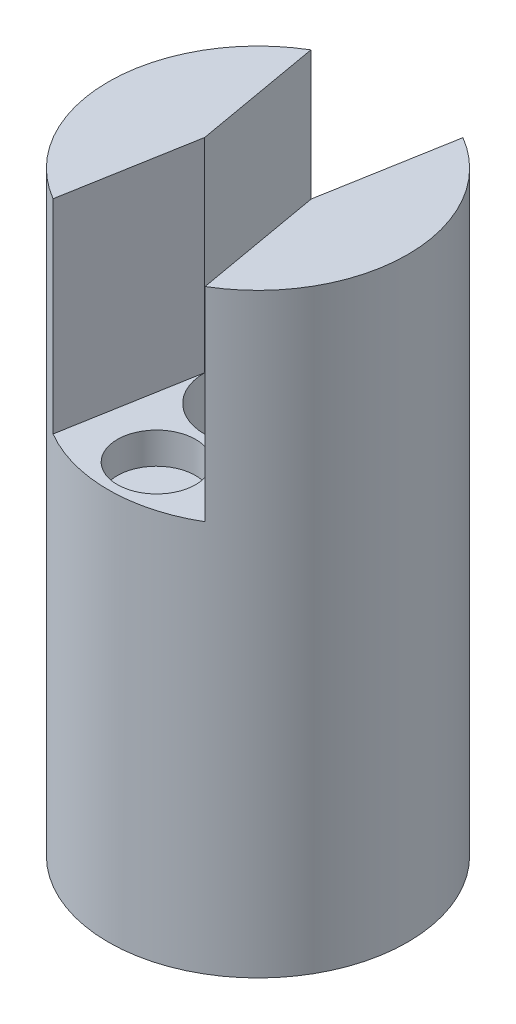
ISO-10303-21;
HEADER;
FILE_DESCRIPTION(('STEP AP214'),'2;1');
FILE_NAME('part.step','',(''),(''),'','','');
FILE_SCHEMA(('AUTOMOTIVE_DESIGN { 1 0 10303 214 1 1 1 1 }'));
ENDSEC;
DATA;
#1=APPLICATION_CONTEXT('core data for automotive mechanical design processes');
#2=APPLICATION_PROTOCOL_DEFINITION('international standard','automotive_design',2000,#1);
#3=PRODUCT_CONTEXT('',#1,'mechanical');
#4=PRODUCT('Part','Part','',(#3));
#5=PRODUCT_RELATED_PRODUCT_CATEGORY('part','',(#4));
#6=PRODUCT_DEFINITION_FORMATION('','',#4);
#7=PRODUCT_DEFINITION_CONTEXT('part definition',#1,'design');
#8=PRODUCT_DEFINITION('design','',#6,#7);
#9=PRODUCT_DEFINITION_SHAPE('','',#8);
#10=(LENGTH_UNIT() NAMED_UNIT(*) SI_UNIT(.MILLI.,.METRE.));
#11=(NAMED_UNIT(*) PLANE_ANGLE_UNIT() SI_UNIT($,.RADIAN.));
#12=(NAMED_UNIT(*) SI_UNIT($,.STERADIAN.) SOLID_ANGLE_UNIT());
#13=UNCERTAINTY_MEASURE_WITH_UNIT(LENGTH_MEASURE(1.E-05),#10,'distance_accuracy_value','');
#14=(GEOMETRIC_REPRESENTATION_CONTEXT(3) GLOBAL_UNCERTAINTY_ASSIGNED_CONTEXT((#13)) GLOBAL_UNIT_ASSIGNED_CONTEXT((#10,
#11,#12)) REPRESENTATION_CONTEXT('',''));
#15=CARTESIAN_POINT('',(0.,0.,0.));
#16=DIRECTION('',(0.,0.,1.));
#17=DIRECTION('',(1.,0.,0.));
#18=AXIS2_PLACEMENT_3D('',#15,#16,#17);
#19=CARTESIAN_POINT('',(0.,25.,0.));
#20=DIRECTION('',(0.,-1.,0.));
#21=DIRECTION('',(0.,0.,-1.));
#22=AXIS2_PLACEMENT_3D('',#19,#20,#21);
#23=CYLINDRICAL_SURFACE('',#22,3.4);
#24=CARTESIAN_POINT('',(0.,20.,0.));
#25=DIRECTION('',(0.,1.,0.));
#26=DIRECTION('',(0.,0.,1.));
#27=AXIS2_PLACEMENT_3D('',#24,#25,#26);
#28=CIRCLE('',#27,3.4);
#29=CARTESIAN_POINT('',(0.,20.,3.4));
#30=VERTEX_POINT('',#29);
#31=EDGE_CURVE('E12',#30,#30,#28,.T.);
#32=ORIENTED_EDGE('',*,*,#31,.F.);
#33=EDGE_LOOP('',(#32));
#34=FACE_BOUND('',#33,.T.);
#35=CARTESIAN_POINT('',(0.,25.,0.));
#36=DIRECTION('',(0.,1.,0.));
#37=DIRECTION('',(0.,0.,1.));
#38=AXIS2_PLACEMENT_3D('',#35,#36,#37);
#39=CIRCLE('',#38,3.4);
#40=CARTESIAN_POINT('',(-3.4,25.,0.));
#41=VERTEX_POINT('',#40);
#42=CARTESIAN_POINT('',(3.4,25.,0.));
#43=VERTEX_POINT('',#42);
#44=EDGE_CURVE('E114',#41,#43,#39,.T.);
#45=ORIENTED_EDGE('',*,*,#44,.T.);
#46=CARTESIAN_POINT('',(0.,25.,0.));
#47=DIRECTION('',(0.,1.,0.));
#48=DIRECTION('',(0.,0.,1.));
#49=AXIS2_PLACEMENT_3D('',#46,#47,#48);
#50=CIRCLE('',#49,3.4);
#51=EDGE_CURVE('E144',#43,#41,#50,.T.);
#52=ORIENTED_EDGE('',*,*,#51,.T.);
#53=EDGE_LOOP('',(#45,#52));
#54=FACE_BOUND('',#53,.T.);
#55=ADVANCED_FACE('F57',(#34,#54),#23,.F.);
#56=CARTESIAN_POINT('',(0.,25.,0.));
#57=DIRECTION('',(0.,-1.,0.));
#58=DIRECTION('',(0.,0.,-1.));
#59=AXIS2_PLACEMENT_3D('',#56,#57,#58);
#60=CYLINDRICAL_SURFACE('',#59,9.55);
#61=CARTESIAN_POINT('',(0.,0.,0.));
#62=DIRECTION('',(0.,1.,0.));
#63=DIRECTION('',(0.,0.,1.));
#64=AXIS2_PLACEMENT_3D('',#61,#62,#63);
#65=CIRCLE('',#64,9.55);
#66=CARTESIAN_POINT('',(0.,0.,9.55));
#67=VERTEX_POINT('',#66);
#68=EDGE_CURVE('E158',#67,#67,#65,.T.);
#69=ORIENTED_EDGE('',*,*,#68,.T.);
#70=EDGE_LOOP('',(#69));
#71=FACE_BOUND('',#70,.T.);
#72=DIRECTION('',(0.,-1.,0.));
#73=VECTOR('',#72,1.);
#74=CARTESIAN_POINT('',(4.85054734967224,38.,8.22646281269098));
#75=LINE('',#74,#73);
#76=CARTESIAN_POINT('',(4.85054734967224,38.,8.22646281269098));
#77=VERTEX_POINT('',#76);
#78=CARTESIAN_POINT('',(4.85054734967224,25.,8.22646281269098));
#79=VERTEX_POINT('',#78);
#80=EDGE_CURVE('E160',#77,#79,#75,.T.);
#81=ORIENTED_EDGE('',*,*,#80,.T.);
#82=CARTESIAN_POINT('',(0.,25.,0.));
#83=DIRECTION('',(0.,1.,0.));
#84=DIRECTION('',(0.,0.,1.));
#85=AXIS2_PLACEMENT_3D('',#82,#83,#84);
#86=CIRCLE('',#85,9.55);
#87=CARTESIAN_POINT('',(-4.85054734967224,25.,8.22646281269098));
#88=VERTEX_POINT('',#87);
#89=EDGE_CURVE('E132',#88,#79,#86,.T.);
#90=ORIENTED_EDGE('',*,*,#89,.F.);
#91=DIRECTION('',(0.,-1.,0.));
#92=VECTOR('',#91,1.);
#93=CARTESIAN_POINT('',(-4.85054734967224,38.,8.22646281269098));
#94=LINE('',#93,#92);
#95=CARTESIAN_POINT('',(-4.85054734967224,38.,8.22646281269098));
#96=VERTEX_POINT('',#95);
#97=EDGE_CURVE('E131',#96,#88,#94,.T.);
#98=ORIENTED_EDGE('',*,*,#97,.F.);
#99=CARTESIAN_POINT('',(0.,38.,0.));
#100=DIRECTION('',(0.,1.,0.));
#101=DIRECTION('',(0.,0.,1.));
#102=AXIS2_PLACEMENT_3D('',#99,#100,#101);
#103=CIRCLE('',#102,9.55);
#104=CARTESIAN_POINT('',(-4.85054734967224,38.,-8.22646281269098));
#105=VERTEX_POINT('',#104);
#106=EDGE_CURVE('E195',#105,#96,#103,.T.);
#107=ORIENTED_EDGE('',*,*,#106,.F.);
#108=DIRECTION('',(0.,-1.,0.));
#109=VECTOR('',#108,1.);
#110=CARTESIAN_POINT('',(-4.85054734967224,38.,-8.22646281269098));
#111=LINE('',#110,#109);
#112=CARTESIAN_POINT('',(-4.85054734967224,25.,-8.22646281269098));
#113=VERTEX_POINT('',#112);
#114=EDGE_CURVE('E191',#105,#113,#111,.T.);
#115=ORIENTED_EDGE('',*,*,#114,.T.);
#116=CARTESIAN_POINT('',(0.,25.,0.));
#117=DIRECTION('',(0.,1.,0.));
#118=DIRECTION('',(0.,0.,1.));
#119=AXIS2_PLACEMENT_3D('',#116,#117,#118);
#120=CIRCLE('',#119,9.55);
#121=CARTESIAN_POINT('',(4.85054734967224,25.,-8.22646281269098));
#122=VERTEX_POINT('',#121);
#123=EDGE_CURVE('E80',#122,#113,#120,.T.);
#124=ORIENTED_EDGE('',*,*,#123,.F.);
#125=DIRECTION('',(0.,-1.,0.));
#126=VECTOR('',#125,1.);
#127=CARTESIAN_POINT('',(4.85054734967224,38.,-8.22646281269098));
#128=LINE('',#127,#126);
#129=CARTESIAN_POINT('',(4.85054734967224,38.,-8.22646281269098));
#130=VERTEX_POINT('',#129);
#131=EDGE_CURVE('E178',#130,#122,#128,.T.);
#132=ORIENTED_EDGE('',*,*,#131,.F.);
#133=CARTESIAN_POINT('',(0.,38.,0.));
#134=DIRECTION('',(0.,1.,0.));
#135=DIRECTION('',(0.,0.,1.));
#136=AXIS2_PLACEMENT_3D('',#133,#134,#135);
#137=CIRCLE('',#136,9.55);
#138=EDGE_CURVE('E186',#77,#130,#137,.T.);
#139=ORIENTED_EDGE('',*,*,#138,.F.);
#140=EDGE_LOOP('',(#81,#90,#98,#107,#115,#124,#132,#139));
#141=FACE_BOUND('',#140,.T.);
#142=ADVANCED_FACE('F168',(#71,#141),#60,.T.);
#143=CARTESIAN_POINT('',(0.,25.,-6.475));
#144=DIRECTION('',(0.,-1.,0.));
#145=DIRECTION('',(0.,0.,-1.));
#146=AXIS2_PLACEMENT_3D('',#143,#144,#145);
#147=CYLINDRICAL_SURFACE('',#146,2.5);
#148=CARTESIAN_POINT('',(0.,23.,-6.475));
#149=DIRECTION('',(0.,1.,0.));
#150=DIRECTION('',(0.,0.,1.));
#151=AXIS2_PLACEMENT_3D('',#148,#149,#150);
#152=CIRCLE('',#151,2.5);
#153=CARTESIAN_POINT('',(0.,23.,-3.975));
#154=VERTEX_POINT('',#153);
#155=EDGE_CURVE('E65',#154,#154,#152,.T.);
#156=ORIENTED_EDGE('',*,*,#155,.F.);
#157=EDGE_LOOP('',(#156));
#158=FACE_BOUND('',#157,.T.);
#159=CARTESIAN_POINT('',(0.,25.,-6.475));
#160=DIRECTION('',(0.,1.,0.));
#161=DIRECTION('',(0.,0.,1.));
#162=AXIS2_PLACEMENT_3D('',#159,#160,#161);
#163=CIRCLE('',#162,2.5);
#164=CARTESIAN_POINT('',(0.,25.,-3.975));
#165=VERTEX_POINT('',#164);
#166=EDGE_CURVE('E148',#165,#165,#163,.T.);
#167=ORIENTED_EDGE('',*,*,#166,.T.);
#168=EDGE_LOOP('',(#167));
#169=FACE_BOUND('',#168,.T.);
#170=ADVANCED_FACE('F59',(#158,#169),#147,.F.);
#171=CARTESIAN_POINT('',(0.,25.,0.));
#172=DIRECTION('',(0.,1.,0.));
#173=DIRECTION('',(0.,0.,1.));
#174=AXIS2_PLACEMENT_3D('',#171,#172,#173);
#175=PLANE('',#174);
#176=ORIENTED_EDGE('',*,*,#166,.F.);
#177=EDGE_LOOP('',(#176));
#178=FACE_BOUND('',#177,.T.);
#179=ORIENTED_EDGE('',*,*,#51,.F.);
#180=DIRECTION('',(0.173648177666927,0.,-0.984807753012209));
#181=VECTOR('',#180,1.);
#182=CARTESIAN_POINT('',(3.29747745533605,25.,0.581434243653627));
#183=LINE('',#182,#181);
#184=EDGE_CURVE('E147',#43,#122,#183,.T.);
#185=ORIENTED_EDGE('',*,*,#184,.T.);
#186=ORIENTED_EDGE('',*,*,#123,.T.);
#187=DIRECTION('',(-0.173648177666927,0.,-0.984807753012209));
#188=VECTOR('',#187,1.);
#189=CARTESIAN_POINT('',(-3.29747745533605,25.,0.581434243653627));
#190=LINE('',#189,#188);
#191=EDGE_CURVE('E138',#41,#113,#190,.T.);
#192=ORIENTED_EDGE('',*,*,#191,.F.);
#193=EDGE_LOOP('',(#179,#185,#186,#192));
#194=FACE_BOUND('',#193,.T.);
#195=ADVANCED_FACE('F150',(#178,#194),#175,.T.);
#196=CARTESIAN_POINT('',(0.,0.,0.));
#197=DIRECTION('',(0.,1.,0.));
#198=DIRECTION('',(0.,0.,1.));
#199=AXIS2_PLACEMENT_3D('',#196,#197,#198);
#200=PLANE('',#199);
#201=ORIENTED_EDGE('',*,*,#68,.F.);
#202=EDGE_LOOP('',(#201));
#203=FACE_BOUND('',#202,.T.);
#204=CARTESIAN_POINT('',(0.,0.,0.));
#205=DIRECTION('',(0.,1.,0.));
#206=DIRECTION('',(0.,0.,1.));
#207=AXIS2_PLACEMENT_3D('',#204,#205,#206);
#208=CIRCLE('',#207,1.);
#209=CARTESIAN_POINT('',(0.,0.,1.));
#210=VERTEX_POINT('',#209);
#211=EDGE_CURVE('E203',#210,#210,#208,.T.);
#212=ORIENTED_EDGE('',*,*,#211,.T.);
#213=EDGE_LOOP('',(#212));
#214=FACE_BOUND('',#213,.T.);
#215=ADVANCED_FACE('F225',(#203,#214),#200,.F.);
#216=CARTESIAN_POINT('',(3.29747745533605,38.,-0.581434243653627));
#217=DIRECTION('',(0.984807753012209,0.,-0.173648177666927));
#218=DIRECTION('',(-0.173648177666927,0.,-0.984807753012209));
#219=AXIS2_PLACEMENT_3D('',#216,#217,#218);
#220=PLANE('',#219);
#221=DIRECTION('',(0.,-1.,0.));
#222=VECTOR('',#221,1.);
#223=CARTESIAN_POINT('',(3.4,38.,0.));
#224=LINE('',#223,#222);
#225=CARTESIAN_POINT('',(3.4,38.,0.));
#226=VERTEX_POINT('',#225);
#227=EDGE_CURVE('E182',#226,#43,#224,.T.);
#228=ORIENTED_EDGE('',*,*,#227,.T.);
#229=DIRECTION('',(0.173648177666927,0.,0.984807753012209));
#230=VECTOR('',#229,1.);
#231=CARTESIAN_POINT('',(3.29747745533605,25.,-0.581434243653627));
#232=LINE('',#231,#230);
#233=EDGE_CURVE('E72',#43,#79,#232,.T.);
#234=ORIENTED_EDGE('',*,*,#233,.T.);
#235=ORIENTED_EDGE('',*,*,#80,.F.);
#236=DIRECTION('',(0.173648177666927,0.,0.984807753012209));
#237=VECTOR('',#236,1.);
#238=CARTESIAN_POINT('',(3.29747745533605,38.,-0.581434243653627));
#239=LINE('',#238,#237);
#240=EDGE_CURVE('E188',#226,#77,#239,.T.);
#241=ORIENTED_EDGE('',*,*,#240,.F.);
#242=EDGE_LOOP('',(#228,#234,#235,#241));
#243=FACE_BOUND('',#242,.T.);
#244=ADVANCED_FACE('F228',(#243),#220,.F.);
#245=CARTESIAN_POINT('',(3.29747745533605,38.,0.581434243653627));
#246=DIRECTION('',(-0.984807753012209,0.,-0.173648177666927));
#247=DIRECTION('',(-0.173648177666927,0.,0.984807753012209));
#248=AXIS2_PLACEMENT_3D('',#245,#246,#247);
#249=PLANE('',#248);
#250=ORIENTED_EDGE('',*,*,#131,.T.);
#251=ORIENTED_EDGE('',*,*,#184,.F.);
#252=ORIENTED_EDGE('',*,*,#227,.F.);
#253=DIRECTION('',(0.173648177666927,0.,-0.984807753012209));
#254=VECTOR('',#253,1.);
#255=CARTESIAN_POINT('',(3.29747745533605,38.,0.581434243653627));
#256=LINE('',#255,#254);
#257=EDGE_CURVE('E181',#226,#130,#256,.T.);
#258=ORIENTED_EDGE('',*,*,#257,.T.);
#259=EDGE_LOOP('',(#250,#251,#252,#258));
#260=FACE_BOUND('',#259,.T.);
#261=ADVANCED_FACE('F179',(#260),#249,.T.);
#262=CARTESIAN_POINT('',(0.,38.,0.));
#263=DIRECTION('',(0.,1.,0.));
#264=DIRECTION('',(0.,0.,1.));
#265=AXIS2_PLACEMENT_3D('',#262,#263,#264);
#266=PLANE('',#265);
#267=ORIENTED_EDGE('',*,*,#240,.T.);
#268=ORIENTED_EDGE('',*,*,#138,.T.);
#269=ORIENTED_EDGE('',*,*,#257,.F.);
#270=EDGE_LOOP('',(#267,#268,#269));
#271=FACE_BOUND('',#270,.T.);
#272=ADVANCED_FACE('F236',(#271),#266,.T.);
#273=CARTESIAN_POINT('',(-3.29747745533605,38.,0.581434243653627));
#274=DIRECTION('',(-0.984807753012209,0.,0.173648177666927));
#275=DIRECTION('',(0.173648177666927,0.,0.984807753012209));
#276=AXIS2_PLACEMENT_3D('',#273,#274,#275);
#277=PLANE('',#276);
#278=ORIENTED_EDGE('',*,*,#191,.T.);
#279=ORIENTED_EDGE('',*,*,#114,.F.);
#280=DIRECTION('',(-0.173648177666927,0.,-0.984807753012209));
#281=VECTOR('',#280,1.);
#282=CARTESIAN_POINT('',(-3.29747745533605,38.,0.581434243653627));
#283=LINE('',#282,#281);
#284=CARTESIAN_POINT('',(-3.4,38.,0.));
#285=VERTEX_POINT('',#284);
#286=EDGE_CURVE('E140',#285,#105,#283,.T.);
#287=ORIENTED_EDGE('',*,*,#286,.F.);
#288=DIRECTION('',(0.,-1.,0.));
#289=VECTOR('',#288,1.);
#290=CARTESIAN_POINT('',(-3.4,38.,0.));
#291=LINE('',#290,#289);
#292=EDGE_CURVE('E128',#285,#41,#291,.T.);
#293=ORIENTED_EDGE('',*,*,#292,.T.);
#294=EDGE_LOOP('',(#278,#279,#287,#293));
#295=FACE_BOUND('',#294,.T.);
#296=ADVANCED_FACE('F135',(#295),#277,.F.);
#297=CARTESIAN_POINT('',(-3.29747745533605,38.,-0.581434243653627));
#298=DIRECTION('',(0.984807753012209,0.,0.173648177666927));
#299=DIRECTION('',(0.173648177666927,0.,-0.984807753012209));
#300=AXIS2_PLACEMENT_3D('',#297,#298,#299);
#301=PLANE('',#300);
#302=DIRECTION('',(-0.173648177666927,0.,0.984807753012209));
#303=VECTOR('',#302,1.);
#304=CARTESIAN_POINT('',(-3.29747745533605,25.,-0.581434243653627));
#305=LINE('',#304,#303);
#306=EDGE_CURVE('E118',#41,#88,#305,.T.);
#307=ORIENTED_EDGE('',*,*,#306,.F.);
#308=ORIENTED_EDGE('',*,*,#292,.F.);
#309=DIRECTION('',(-0.173648177666927,0.,0.984807753012209));
#310=VECTOR('',#309,1.);
#311=CARTESIAN_POINT('',(-3.29747745533605,38.,-0.581434243653627));
#312=LINE('',#311,#310);
#313=EDGE_CURVE('E142',#285,#96,#312,.T.);
#314=ORIENTED_EDGE('',*,*,#313,.T.);
#315=ORIENTED_EDGE('',*,*,#97,.T.);
#316=EDGE_LOOP('',(#307,#308,#314,#315));
#317=FACE_BOUND('',#316,.T.);
#318=ADVANCED_FACE('F126',(#317),#301,.T.);
#319=CARTESIAN_POINT('',(0.,38.,0.));
#320=DIRECTION('',(0.,1.,0.));
#321=DIRECTION('',(0.,0.,1.));
#322=AXIS2_PLACEMENT_3D('',#319,#320,#321);
#323=PLANE('',#322);
#324=ORIENTED_EDGE('',*,*,#286,.T.);
#325=ORIENTED_EDGE('',*,*,#106,.T.);
#326=ORIENTED_EDGE('',*,*,#313,.F.);
#327=EDGE_LOOP('',(#324,#325,#326));
#328=FACE_BOUND('',#327,.T.);
#329=ADVANCED_FACE('F244',(#328),#323,.T.);
#330=CARTESIAN_POINT('',(0.,25.,6.475));
#331=DIRECTION('',(0.,-1.,0.));
#332=DIRECTION('',(0.,0.,-1.));
#333=AXIS2_PLACEMENT_3D('',#330,#331,#332);
#334=CYLINDRICAL_SURFACE('',#333,2.5);
#335=CARTESIAN_POINT('',(0.,23.,6.475));
#336=DIRECTION('',(0.,1.,0.));
#337=DIRECTION('',(0.,0.,1.));
#338=AXIS2_PLACEMENT_3D('',#335,#336,#337);
#339=CIRCLE('',#338,2.5);
#340=CARTESIAN_POINT('',(0.,23.,8.975));
#341=VERTEX_POINT('',#340);
#342=EDGE_CURVE('E151',#341,#341,#339,.T.);
#343=ORIENTED_EDGE('',*,*,#342,.F.);
#344=EDGE_LOOP('',(#343));
#345=FACE_BOUND('',#344,.T.);
#346=CARTESIAN_POINT('',(0.,25.,6.475));
#347=DIRECTION('',(0.,1.,0.));
#348=DIRECTION('',(0.,0.,1.));
#349=AXIS2_PLACEMENT_3D('',#346,#347,#348);
#350=CIRCLE('',#349,2.5);
#351=CARTESIAN_POINT('',(0.,25.,8.975));
#352=VERTEX_POINT('',#351);
#353=EDGE_CURVE('E122',#352,#352,#350,.T.);
#354=ORIENTED_EDGE('',*,*,#353,.T.);
#355=EDGE_LOOP('',(#354));
#356=FACE_BOUND('',#355,.T.);
#357=ADVANCED_FACE('F247',(#345,#356),#334,.F.);
#358=CARTESIAN_POINT('',(0.,25.,0.));
#359=DIRECTION('',(0.,1.,0.));
#360=DIRECTION('',(0.,0.,1.));
#361=AXIS2_PLACEMENT_3D('',#358,#359,#360);
#362=PLANE('',#361);
#363=ORIENTED_EDGE('',*,*,#353,.F.);
#364=EDGE_LOOP('',(#363));
#365=FACE_BOUND('',#364,.T.);
#366=ORIENTED_EDGE('',*,*,#44,.F.);
#367=ORIENTED_EDGE('',*,*,#306,.T.);
#368=ORIENTED_EDGE('',*,*,#89,.T.);
#369=ORIENTED_EDGE('',*,*,#233,.F.);
#370=EDGE_LOOP('',(#366,#367,#368,#369));
#371=FACE_BOUND('',#370,.T.);
#372=ADVANCED_FACE('F116',(#365,#371),#362,.T.);
#373=CARTESIAN_POINT('',(0.,23.,0.));
#374=DIRECTION('',(0.,1.,0.));
#375=DIRECTION('',(0.,0.,1.));
#376=AXIS2_PLACEMENT_3D('',#373,#374,#375);
#377=PLANE('',#376);
#378=ORIENTED_EDGE('',*,*,#342,.T.);
#379=EDGE_LOOP('',(#378));
#380=FACE_BOUND('',#379,.T.);
#381=ADVANCED_FACE('F254',(#380),#377,.T.);
#382=CARTESIAN_POINT('',(0.,23.,0.));
#383=DIRECTION('',(0.,1.,0.));
#384=DIRECTION('',(0.,0.,1.));
#385=AXIS2_PLACEMENT_3D('',#382,#383,#384);
#386=PLANE('',#385);
#387=ORIENTED_EDGE('',*,*,#155,.T.);
#388=EDGE_LOOP('',(#387));
#389=FACE_BOUND('',#388,.T.);
#390=ADVANCED_FACE('F164',(#389),#386,.T.);
#391=CARTESIAN_POINT('',(0.,20.,0.));
#392=DIRECTION('',(0.,-1.,0.));
#393=DIRECTION('',(0.,0.,-1.));
#394=AXIS2_PLACEMENT_3D('',#391,#392,#393);
#395=CYLINDRICAL_SURFACE('',#394,1.);
#396=CARTESIAN_POINT('',(0.,20.,0.));
#397=DIRECTION('',(0.,1.,0.));
#398=DIRECTION('',(0.,0.,1.));
#399=AXIS2_PLACEMENT_3D('',#396,#397,#398);
#400=CIRCLE('',#399,1.);
#401=CARTESIAN_POINT('',(0.,20.,1.));
#402=VERTEX_POINT('',#401);
#403=EDGE_CURVE('E202',#402,#402,#400,.T.);
#404=ORIENTED_EDGE('',*,*,#403,.T.);
#405=EDGE_LOOP('',(#404));
#406=FACE_BOUND('',#405,.T.);
#407=ORIENTED_EDGE('',*,*,#211,.F.);
#408=EDGE_LOOP('',(#407));
#409=FACE_BOUND('',#408,.T.);
#410=ADVANCED_FACE('F209',(#406,#409),#395,.F.);
#411=CARTESIAN_POINT('',(0.,20.,0.));
#412=DIRECTION('',(0.,1.,0.));
#413=DIRECTION('',(0.,0.,1.));
#414=AXIS2_PLACEMENT_3D('',#411,#412,#413);
#415=PLANE('',#414);
#416=ORIENTED_EDGE('',*,*,#403,.F.);
#417=EDGE_LOOP('',(#416));
#418=FACE_BOUND('',#417,.T.);
#419=ORIENTED_EDGE('',*,*,#31,.T.);
#420=EDGE_LOOP('',(#419));
#421=FACE_BOUND('',#420,.T.);
#422=ADVANCED_FACE('F212',(#418,#421),#415,.T.);
#423=CLOSED_SHELL('',(#55,#142,#170,#195,#215,#244,#261,#272,#296,#318,#329,#357,#372,#381,#390,
#410,#422));
#424=MANIFOLD_SOLID_BREP('B2',#423);
#425=ADVANCED_BREP_SHAPE_REPRESENTATION('',(#18,#424),#14);
#426=SHAPE_DEFINITION_REPRESENTATION(#9,#425);
ENDSEC;
END-ISO-10303-21;
